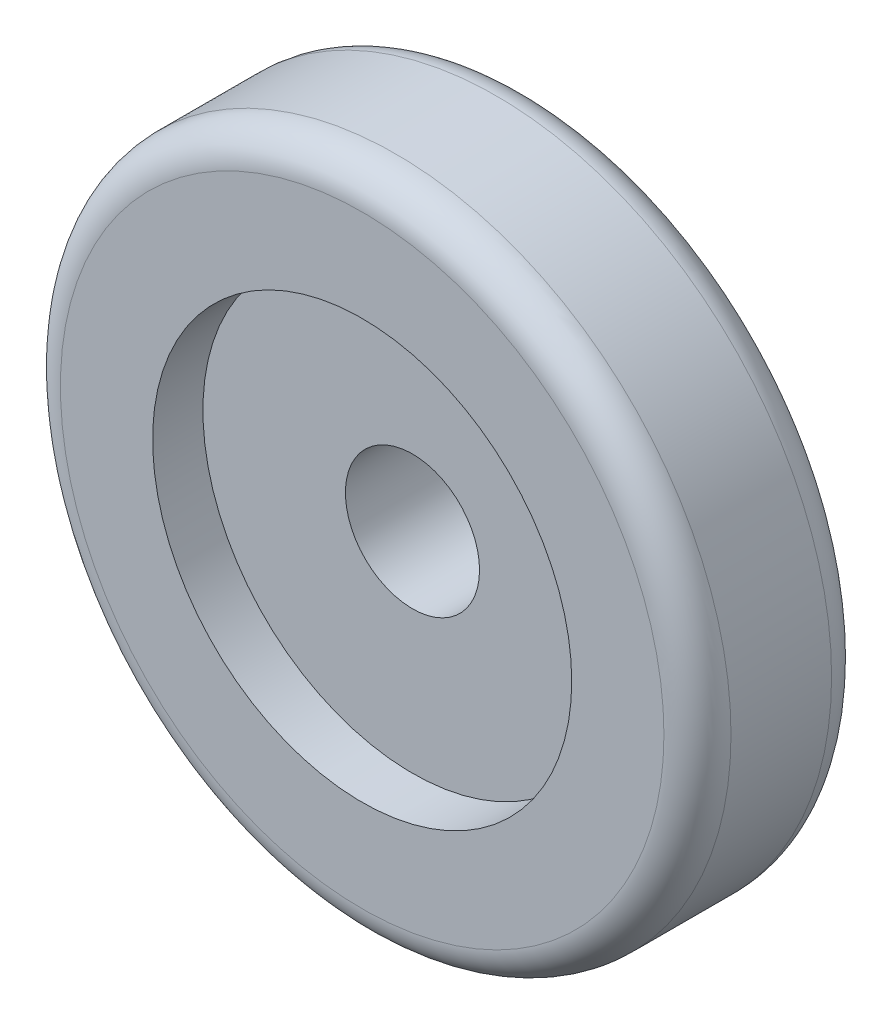
ISO-10303-21;
HEADER;
FILE_DESCRIPTION(('STEP AP214'),'2;1');
FILE_NAME('part.step','',(''),(''),'','','');
FILE_SCHEMA(('AUTOMOTIVE_DESIGN { 1 0 10303 214 1 1 1 1 }'));
ENDSEC;
DATA;
#1=APPLICATION_CONTEXT('core data for automotive mechanical design processes');
#2=APPLICATION_PROTOCOL_DEFINITION('international standard','automotive_design',2000,#1);
#3=PRODUCT_CONTEXT('',#1,'mechanical');
#4=PRODUCT('Part','Part','',(#3));
#5=PRODUCT_RELATED_PRODUCT_CATEGORY('part','',(#4));
#6=PRODUCT_DEFINITION_FORMATION('','',#4);
#7=PRODUCT_DEFINITION_CONTEXT('part definition',#1,'design');
#8=PRODUCT_DEFINITION('design','',#6,#7);
#9=PRODUCT_DEFINITION_SHAPE('','',#8);
#10=(LENGTH_UNIT() NAMED_UNIT(*) SI_UNIT(.MILLI.,.METRE.));
#11=(NAMED_UNIT(*) PLANE_ANGLE_UNIT() SI_UNIT($,.RADIAN.));
#12=(NAMED_UNIT(*) SI_UNIT($,.STERADIAN.) SOLID_ANGLE_UNIT());
#13=UNCERTAINTY_MEASURE_WITH_UNIT(LENGTH_MEASURE(1.E-05),#10,'distance_accuracy_value','');
#14=(GEOMETRIC_REPRESENTATION_CONTEXT(3) GLOBAL_UNCERTAINTY_ASSIGNED_CONTEXT((#13)) GLOBAL_UNIT_ASSIGNED_CONTEXT((#10,
#11,#12)) REPRESENTATION_CONTEXT('',''));
#15=CARTESIAN_POINT('',(0.,0.,0.));
#16=DIRECTION('',(0.,0.,1.));
#17=DIRECTION('',(1.,0.,0.));
#18=AXIS2_PLACEMENT_3D('',#15,#16,#17);
#19=CARTESIAN_POINT('',(0.,0.,0.));
#20=DIRECTION('',(0.,0.,1.));
#21=DIRECTION('',(1.,0.,0.));
#22=AXIS2_PLACEMENT_3D('',#19,#20,#21);
#23=CYLINDRICAL_SURFACE('',#22,4.);
#24=CARTESIAN_POINT('',(0.,0.,0.));
#25=DIRECTION('',(0.,0.,1.));
#26=DIRECTION('',(1.,0.,0.));
#27=AXIS2_PLACEMENT_3D('',#24,#25,#26);
#28=CIRCLE('',#27,4.);
#29=CARTESIAN_POINT('',(4.,0.,0.));
#30=VERTEX_POINT('',#29);
#31=EDGE_CURVE('E54',#30,#30,#28,.T.);
#32=ORIENTED_EDGE('',*,*,#31,.F.);
#33=EDGE_LOOP('',(#32));
#34=FACE_BOUND('',#33,.T.);
#35=CARTESIAN_POINT('',(0.,0.,7.));
#36=DIRECTION('',(0.,0.,1.));
#37=DIRECTION('',(1.,0.,0.));
#38=AXIS2_PLACEMENT_3D('',#35,#36,#37);
#39=CIRCLE('',#38,4.);
#40=CARTESIAN_POINT('',(4.,0.,7.));
#41=VERTEX_POINT('',#40);
#42=EDGE_CURVE('E55',#41,#41,#39,.F.);
#43=ORIENTED_EDGE('',*,*,#42,.F.);
#44=EDGE_LOOP('',(#43));
#45=FACE_BOUND('',#44,.T.);
#46=ADVANCED_FACE('F34',(#34,#45),#23,.F.);
#47=CARTESIAN_POINT('',(0.,0.,10.));
#48=DIRECTION('',(0.,0.,-1.));
#49=DIRECTION('',(-1.,0.,0.));
#50=AXIS2_PLACEMENT_3D('',#47,#48,#49);
#51=CYLINDRICAL_SURFACE('',#50,20.);
#52=CARTESIAN_POINT('',(0.,0.,2.));
#53=DIRECTION('',(0.,0.,1.));
#54=DIRECTION('',(1.,0.,0.));
#55=AXIS2_PLACEMENT_3D('',#52,#53,#54);
#56=CIRCLE('',#55,20.);
#57=CARTESIAN_POINT('',(20.,0.,2.));
#58=VERTEX_POINT('',#57);
#59=EDGE_CURVE('E45',#58,#58,#56,.T.);
#60=ORIENTED_EDGE('',*,*,#59,.T.);
#61=EDGE_LOOP('',(#60));
#62=FACE_BOUND('',#61,.T.);
#63=CARTESIAN_POINT('',(0.,0.,8.));
#64=DIRECTION('',(0.,0.,1.));
#65=DIRECTION('',(1.,0.,0.));
#66=AXIS2_PLACEMENT_3D('',#63,#64,#65);
#67=CIRCLE('',#66,20.);
#68=CARTESIAN_POINT('',(20.,0.,8.));
#69=VERTEX_POINT('',#68);
#70=EDGE_CURVE('E49',#69,#69,#67,.F.);
#71=ORIENTED_EDGE('',*,*,#70,.T.);
#72=EDGE_LOOP('',(#71));
#73=FACE_BOUND('',#72,.T.);
#74=ADVANCED_FACE('F80',(#62,#73),#51,.T.);
#75=CARTESIAN_POINT('',(0.,0.,10.));
#76=DIRECTION('',(0.,0.,1.));
#77=DIRECTION('',(1.,0.,0.));
#78=AXIS2_PLACEMENT_3D('',#75,#76,#77);
#79=PLANE('',#78);
#80=CARTESIAN_POINT('',(0.,0.,10.));
#81=DIRECTION('',(0.,0.,1.));
#82=DIRECTION('',(1.,0.,0.));
#83=AXIS2_PLACEMENT_3D('',#80,#81,#82);
#84=CIRCLE('',#83,18.);
#85=CARTESIAN_POINT('',(18.,0.,10.));
#86=VERTEX_POINT('',#85);
#87=EDGE_CURVE('E10',#86,#86,#84,.T.);
#88=ORIENTED_EDGE('',*,*,#87,.T.);
#89=EDGE_LOOP('',(#88));
#90=FACE_BOUND('',#89,.T.);
#91=CARTESIAN_POINT('',(0.,0.,10.));
#92=DIRECTION('',(0.,0.,1.));
#93=DIRECTION('',(1.,0.,0.));
#94=AXIS2_PLACEMENT_3D('',#91,#92,#93);
#95=CIRCLE('',#94,12.5);
#96=CARTESIAN_POINT('',(12.5,0.,10.));
#97=VERTEX_POINT('',#96);
#98=EDGE_CURVE('E61',#97,#97,#95,.T.);
#99=ORIENTED_EDGE('',*,*,#98,.F.);
#100=EDGE_LOOP('',(#99));
#101=FACE_BOUND('',#100,.T.);
#102=ADVANCED_FACE('F77',(#90,#101),#79,.T.);
#103=CARTESIAN_POINT('',(0.,0.,0.));
#104=DIRECTION('',(0.,0.,1.));
#105=DIRECTION('',(1.,0.,0.));
#106=AXIS2_PLACEMENT_3D('',#103,#104,#105);
#107=PLANE('',#106);
#108=CARTESIAN_POINT('',(0.,0.,0.));
#109=DIRECTION('',(0.,0.,1.));
#110=DIRECTION('',(1.,0.,0.));
#111=AXIS2_PLACEMENT_3D('',#108,#109,#110);
#112=CIRCLE('',#111,18.);
#113=CARTESIAN_POINT('',(18.,0.,0.));
#114=VERTEX_POINT('',#113);
#115=EDGE_CURVE('E41',#114,#114,#112,.F.);
#116=ORIENTED_EDGE('',*,*,#115,.T.);
#117=EDGE_LOOP('',(#116));
#118=FACE_BOUND('',#117,.T.);
#119=ORIENTED_EDGE('',*,*,#31,.T.);
#120=EDGE_LOOP('',(#119));
#121=FACE_BOUND('',#120,.T.);
#122=ADVANCED_FACE('F79',(#118,#121),#107,.F.);
#123=CARTESIAN_POINT('',(0.,0.,7.));
#124=DIRECTION('',(0.,0.,1.));
#125=DIRECTION('',(1.,0.,0.));
#126=AXIS2_PLACEMENT_3D('',#123,#124,#125);
#127=PLANE('',#126);
#128=CARTESIAN_POINT('',(0.,0.,7.));
#129=DIRECTION('',(0.,0.,1.));
#130=DIRECTION('',(1.,0.,0.));
#131=AXIS2_PLACEMENT_3D('',#128,#129,#130);
#132=CIRCLE('',#131,12.5);
#133=CARTESIAN_POINT('',(12.5,0.,7.));
#134=VERTEX_POINT('',#133);
#135=EDGE_CURVE('E58',#134,#134,#132,.T.);
#136=ORIENTED_EDGE('',*,*,#135,.T.);
#137=EDGE_LOOP('',(#136));
#138=FACE_BOUND('',#137,.T.);
#139=ORIENTED_EDGE('',*,*,#42,.T.);
#140=EDGE_LOOP('',(#139));
#141=FACE_BOUND('',#140,.T.);
#142=ADVANCED_FACE('F67',(#138,#141),#127,.T.);
#143=CARTESIAN_POINT('',(0.,0.,7.));
#144=DIRECTION('',(0.,0.,1.));
#145=DIRECTION('',(1.,0.,0.));
#146=AXIS2_PLACEMENT_3D('',#143,#144,#145);
#147=CYLINDRICAL_SURFACE('',#146,12.5);
#148=ORIENTED_EDGE('',*,*,#135,.F.);
#149=EDGE_LOOP('',(#148));
#150=FACE_BOUND('',#149,.T.);
#151=ORIENTED_EDGE('',*,*,#98,.T.);
#152=EDGE_LOOP('',(#151));
#153=FACE_BOUND('',#152,.T.);
#154=ADVANCED_FACE('F70',(#150,#153),#147,.F.);
#155=CARTESIAN_POINT('',(0.,0.,2.));
#156=DIRECTION('',(0.,0.,1.));
#157=DIRECTION('',(1.,0.,0.));
#158=AXIS2_PLACEMENT_3D('',#155,#156,#157);
#159=TOROIDAL_SURFACE('',#158,18.,2.);
#160=ORIENTED_EDGE('',*,*,#115,.F.);
#161=EDGE_LOOP('',(#160));
#162=FACE_BOUND('',#161,.T.);
#163=ORIENTED_EDGE('',*,*,#59,.F.);
#164=EDGE_LOOP('',(#163));
#165=FACE_BOUND('',#164,.T.);
#166=ADVANCED_FACE('F73',(#162,#165),#159,.T.);
#167=CARTESIAN_POINT('',(0.,0.,8.));
#168=DIRECTION('',(0.,0.,1.));
#169=DIRECTION('',(1.,0.,0.));
#170=AXIS2_PLACEMENT_3D('',#167,#168,#169);
#171=TOROIDAL_SURFACE('',#170,18.,2.);
#172=ORIENTED_EDGE('',*,*,#70,.F.);
#173=EDGE_LOOP('',(#172));
#174=FACE_BOUND('',#173,.T.);
#175=ORIENTED_EDGE('',*,*,#87,.F.);
#176=EDGE_LOOP('',(#175));
#177=FACE_BOUND('',#176,.T.);
#178=ADVANCED_FACE('F36',(#174,#177),#171,.T.);
#179=CLOSED_SHELL('',(#46,#74,#102,#122,#142,#154,#166,#178));
#180=MANIFOLD_SOLID_BREP('B2',#179);
#181=ADVANCED_BREP_SHAPE_REPRESENTATION('',(#18,#180),#14);
#182=SHAPE_DEFINITION_REPRESENTATION(#9,#181);
ENDSEC;
END-ISO-10303-21;
